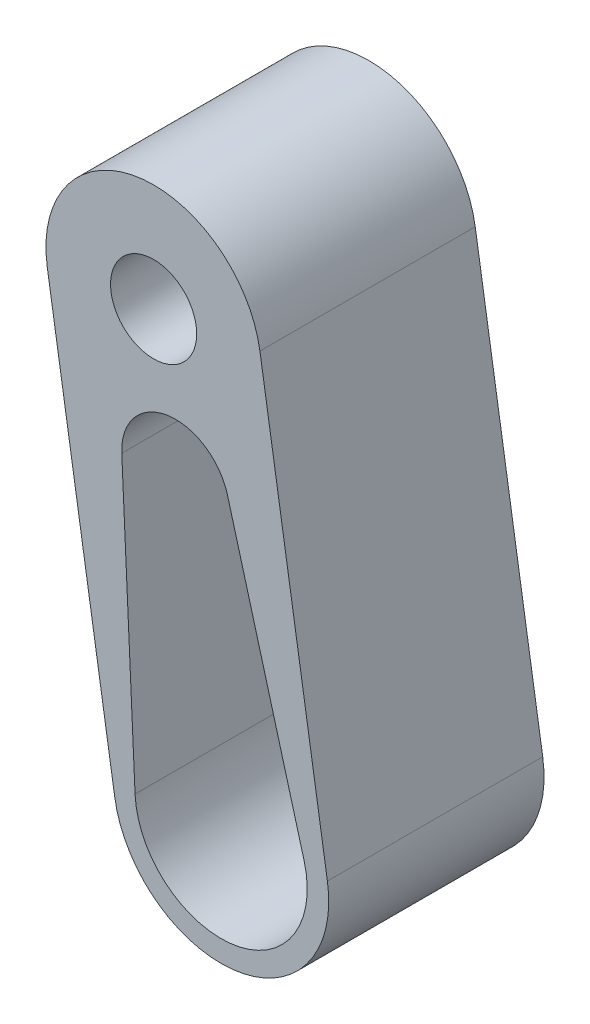
ISO-10303-21;
HEADER;
FILE_DESCRIPTION(('STEP AP214'),'2;1');
FILE_NAME('part.step','',(''),(''),'','','');
FILE_SCHEMA(('AUTOMOTIVE_DESIGN { 1 0 10303 214 1 1 1 1 }'));
ENDSEC;
DATA;
#1=APPLICATION_CONTEXT('core data for automotive mechanical design processes');
#2=APPLICATION_PROTOCOL_DEFINITION('international standard','automotive_design',2000,#1);
#3=PRODUCT_CONTEXT('',#1,'mechanical');
#4=PRODUCT('Part','Part','',(#3));
#5=PRODUCT_RELATED_PRODUCT_CATEGORY('part','',(#4));
#6=PRODUCT_DEFINITION_FORMATION('','',#4);
#7=PRODUCT_DEFINITION_CONTEXT('part definition',#1,'design');
#8=PRODUCT_DEFINITION('design','',#6,#7);
#9=PRODUCT_DEFINITION_SHAPE('','',#8);
#10=(LENGTH_UNIT() NAMED_UNIT(*) SI_UNIT(.MILLI.,.METRE.));
#11=(NAMED_UNIT(*) PLANE_ANGLE_UNIT() SI_UNIT($,.RADIAN.));
#12=(NAMED_UNIT(*) SI_UNIT($,.STERADIAN.) SOLID_ANGLE_UNIT());
#13=UNCERTAINTY_MEASURE_WITH_UNIT(LENGTH_MEASURE(1.E-05),#10,'distance_accuracy_value','');
#14=(GEOMETRIC_REPRESENTATION_CONTEXT(3) GLOBAL_UNCERTAINTY_ASSIGNED_CONTEXT((#13)) GLOBAL_UNIT_ASSIGNED_CONTEXT((#10,
#11,#12)) REPRESENTATION_CONTEXT('',''));
#15=CARTESIAN_POINT('',(0.,0.,0.));
#16=DIRECTION('',(0.,0.,1.));
#17=DIRECTION('',(1.,0.,0.));
#18=AXIS2_PLACEMENT_3D('',#15,#16,#17);
#19=CARTESIAN_POINT('',(-59.1343390927748,15.7528711445072,10.));
#20=DIRECTION('',(0.,0.,1.));
#21=DIRECTION('',(1.,0.,0.));
#22=AXIS2_PLACEMENT_3D('',#19,#20,#21);
#23=PLANE('',#22);
#24=CARTESIAN_POINT('',(-59.1343390927748,15.7528711445072,10.));
#25=DIRECTION('',(0.,0.,1.));
#26=DIRECTION('',(1.,0.,0.));
#27=AXIS2_PLACEMENT_3D('',#24,#25,#26);
#28=CIRCLE('',#27,5.);
#29=CARTESIAN_POINT('',(-54.196121306648,16.5364559177009,10.));
#30=VERTEX_POINT('',#29);
#31=CARTESIAN_POINT('',(-64.0725568789016,14.9692863713135,10.));
#32=VERTEX_POINT('',#31);
#33=EDGE_CURVE('E166',#30,#32,#28,.T.);
#34=ORIENTED_EDGE('',*,*,#33,.T.);
#35=DIRECTION('',(0.156716954638739,-0.987643557225358,0.));
#36=VECTOR('',#35,1.);
#37=CARTESIAN_POINT('',(-64.0725568789016,14.9692863713135,10.));
#38=LINE('',#37,#36);
#39=CARTESIAN_POINT('',(-60.9382177861268,-4.78358477319369,10.));
#40=VERTEX_POINT('',#39);
#41=EDGE_CURVE('E92',#32,#40,#38,.T.);
#42=ORIENTED_EDGE('',*,*,#41,.T.);
#43=CARTESIAN_POINT('',(-56.,-4.,10.));
#44=DIRECTION('',(0.,0.,1.));
#45=DIRECTION('',(1.,0.,0.));
#46=AXIS2_PLACEMENT_3D('',#43,#44,#45);
#47=CIRCLE('',#46,5.);
#48=CARTESIAN_POINT('',(-51.0617822138732,-3.21641522680631,10.));
#49=VERTEX_POINT('',#48);
#50=EDGE_CURVE('E169',#40,#49,#47,.T.);
#51=ORIENTED_EDGE('',*,*,#50,.T.);
#52=DIRECTION('',(-0.156716954638739,0.987643557225358,0.));
#53=VECTOR('',#52,1.);
#54=CARTESIAN_POINT('',(-54.196121306648,16.5364559177009,10.));
#55=LINE('',#54,#53);
#56=EDGE_CURVE('E64',#49,#30,#55,.T.);
#57=ORIENTED_EDGE('',*,*,#56,.T.);
#58=EDGE_LOOP('',(#34,#42,#51,#57));
#59=FACE_BOUND('',#58,.T.);
#60=CARTESIAN_POINT('',(-59.1343390927748,15.7528711445072,10.));
#61=DIRECTION('',(0.,0.,1.));
#62=DIRECTION('',(1.,0.,0.));
#63=AXIS2_PLACEMENT_3D('',#60,#61,#62);
#64=CIRCLE('',#63,2.);
#65=CARTESIAN_POINT('',(-57.1343390927748,15.7528711445072,10.));
#66=VERTEX_POINT('',#65);
#67=EDGE_CURVE('E160',#66,#66,#64,.T.);
#68=ORIENTED_EDGE('',*,*,#67,.F.);
#69=EDGE_LOOP('',(#68));
#70=FACE_BOUND('',#69,.T.);
#71=CARTESIAN_POINT('',(-58.115678887623,9.33318802254233,10.));
#72=DIRECTION('',(0.,0.,1.));
#73=DIRECTION('',(1.,0.,0.));
#74=AXIS2_PLACEMENT_3D('',#71,#72,#73);
#75=CIRCLE('',#74,2.5);
#76=CARTESIAN_POINT('',(-55.7053912289164,9.99689985932601,10.));
#77=VERTEX_POINT('',#76);
#78=CARTESIAN_POINT('',(-60.6130315211288,9.21816705088385,10.));
#79=VERTEX_POINT('',#78);
#80=EDGE_CURVE('E144',#77,#79,#75,.T.);
#81=ORIENTED_EDGE('',*,*,#80,.F.);
#82=DIRECTION('',(0.265484734713471,-0.964115063482631,0.));
#83=VECTOR('',#82,1.);
#84=CARTESIAN_POINT('',(-49.2203709890279,-13.5536282228787,10.));
#85=LINE('',#84,#83);
#86=CARTESIAN_POINT('',(-52.1435397460695,-2.93806106114612,10.));
#87=VERTEX_POINT('',#86);
#88=EDGE_CURVE('E55',#77,#87,#85,.T.);
#89=ORIENTED_EDGE('',*,*,#88,.T.);
#90=CARTESIAN_POINT('',(-56.,-4.,10.));
#91=DIRECTION('',(0.,0.,1.));
#92=DIRECTION('',(1.,0.,0.));
#93=AXIS2_PLACEMENT_3D('',#90,#91,#92);
#94=CIRCLE('',#93,4.);
#95=CARTESIAN_POINT('',(-59.9957642136094,-4.18403355465357,10.));
#96=VERTEX_POINT('',#95);
#97=EDGE_CURVE('E132',#96,#87,#94,.T.);
#98=ORIENTED_EDGE('',*,*,#97,.F.);
#99=DIRECTION('',(0.0460083886633916,-0.998941053402351,0.));
#100=VECTOR('',#99,1.);
#101=CARTESIAN_POINT('',(-60.0610636642219,-2.76624206322135,10.));
#102=LINE('',#101,#100);
#103=EDGE_CURVE('E146',#79,#96,#102,.T.);
#104=ORIENTED_EDGE('',*,*,#103,.F.);
#105=EDGE_LOOP('',(#81,#89,#98,#104));
#106=FACE_BOUND('',#105,.T.);
#107=ADVANCED_FACE('F40',(#59,#70,#106),#23,.T.);
#108=CARTESIAN_POINT('',(-56.,-4.,10.));
#109=DIRECTION('',(0.,0.,-1.));
#110=DIRECTION('',(-1.,0.,0.));
#111=AXIS2_PLACEMENT_3D('',#108,#109,#110);
#112=CYLINDRICAL_SURFACE('',#111,2.);
#113=CARTESIAN_POINT('',(-56.,-4.,0.));
#114=DIRECTION('',(0.,0.,1.));
#115=DIRECTION('',(1.,0.,0.));
#116=AXIS2_PLACEMENT_3D('',#113,#114,#115);
#117=CIRCLE('',#116,2.);
#118=CARTESIAN_POINT('',(-54.,-4.,0.));
#119=VERTEX_POINT('',#118);
#120=EDGE_CURVE('E153',#119,#119,#117,.T.);
#121=ORIENTED_EDGE('',*,*,#120,.F.);
#122=EDGE_LOOP('',(#121));
#123=FACE_BOUND('',#122,.T.);
#124=CARTESIAN_POINT('',(-56.,-4.,2.));
#125=DIRECTION('',(0.,0.,1.));
#126=DIRECTION('',(1.,0.,0.));
#127=AXIS2_PLACEMENT_3D('',#124,#125,#126);
#128=CIRCLE('',#127,2.);
#129=CARTESIAN_POINT('',(-54.,-4.,2.));
#130=VERTEX_POINT('',#129);
#131=EDGE_CURVE('E121',#130,#130,#128,.F.);
#132=ORIENTED_EDGE('',*,*,#131,.F.);
#133=EDGE_LOOP('',(#132));
#134=FACE_BOUND('',#133,.T.);
#135=ADVANCED_FACE('F209',(#123,#134),#112,.F.);
#136=CARTESIAN_POINT('',(-59.1343390927748,15.7528711445072,0.));
#137=DIRECTION('',(0.,0.,1.));
#138=DIRECTION('',(1.,0.,0.));
#139=AXIS2_PLACEMENT_3D('',#136,#137,#138);
#140=PLANE('',#139);
#141=CARTESIAN_POINT('',(-59.1343390927748,15.7528711445072,0.));
#142=DIRECTION('',(0.,0.,1.));
#143=DIRECTION('',(1.,0.,0.));
#144=AXIS2_PLACEMENT_3D('',#141,#142,#143);
#145=CIRCLE('',#144,5.);
#146=CARTESIAN_POINT('',(-54.196121306648,16.5364559177009,0.));
#147=VERTEX_POINT('',#146);
#148=CARTESIAN_POINT('',(-64.0725568789016,14.9692863713135,0.));
#149=VERTEX_POINT('',#148);
#150=EDGE_CURVE('E163',#147,#149,#145,.T.);
#151=ORIENTED_EDGE('',*,*,#150,.F.);
#152=DIRECTION('',(-0.156716954638739,0.987643557225358,0.));
#153=VECTOR('',#152,1.);
#154=CARTESIAN_POINT('',(-54.196121306648,16.5364559177009,0.));
#155=LINE('',#154,#153);
#156=CARTESIAN_POINT('',(-51.0617822138732,-3.21641522680631,0.));
#157=VERTEX_POINT('',#156);
#158=EDGE_CURVE('E85',#157,#147,#155,.T.);
#159=ORIENTED_EDGE('',*,*,#158,.F.);
#160=CARTESIAN_POINT('',(-56.,-4.,0.));
#161=DIRECTION('',(0.,0.,1.));
#162=DIRECTION('',(1.,0.,0.));
#163=AXIS2_PLACEMENT_3D('',#160,#161,#162);
#164=CIRCLE('',#163,5.);
#165=CARTESIAN_POINT('',(-60.9382177861268,-4.78358477319369,0.));
#166=VERTEX_POINT('',#165);
#167=EDGE_CURVE('E177',#166,#157,#164,.T.);
#168=ORIENTED_EDGE('',*,*,#167,.F.);
#169=DIRECTION('',(0.156716954638739,-0.987643557225358,0.));
#170=VECTOR('',#169,1.);
#171=CARTESIAN_POINT('',(-64.0725568789016,14.9692863713135,0.));
#172=LINE('',#171,#170);
#173=EDGE_CURVE('E175',#149,#166,#172,.T.);
#174=ORIENTED_EDGE('',*,*,#173,.F.);
#175=EDGE_LOOP('',(#151,#159,#168,#174));
#176=FACE_BOUND('',#175,.T.);
#177=CARTESIAN_POINT('',(-59.1343390927748,15.7528711445072,0.));
#178=DIRECTION('',(0.,0.,1.));
#179=DIRECTION('',(1.,0.,0.));
#180=AXIS2_PLACEMENT_3D('',#177,#178,#179);
#181=CIRCLE('',#180,2.);
#182=CARTESIAN_POINT('',(-57.1343390927748,15.7528711445072,0.));
#183=VERTEX_POINT('',#182);
#184=EDGE_CURVE('E159',#183,#183,#181,.T.);
#185=ORIENTED_EDGE('',*,*,#184,.T.);
#186=EDGE_LOOP('',(#185));
#187=FACE_BOUND('',#186,.T.);
#188=ORIENTED_EDGE('',*,*,#120,.T.);
#189=EDGE_LOOP('',(#188));
#190=FACE_BOUND('',#189,.T.);
#191=ADVANCED_FACE('F190',(#176,#187,#190),#140,.F.);
#192=CARTESIAN_POINT('',(-59.1343390927748,15.7528711445072,10.));
#193=DIRECTION('',(0.,0.,-1.));
#194=DIRECTION('',(-1.,0.,0.));
#195=AXIS2_PLACEMENT_3D('',#192,#193,#194);
#196=CYLINDRICAL_SURFACE('',#195,5.);
#197=ORIENTED_EDGE('',*,*,#150,.T.);
#198=DIRECTION('',(0.,0.,-1.));
#199=VECTOR('',#198,1.);
#200=CARTESIAN_POINT('',(-64.0725568789016,14.9692863713135,10.));
#201=LINE('',#200,#199);
#202=EDGE_CURVE('E11',#32,#149,#201,.T.);
#203=ORIENTED_EDGE('',*,*,#202,.F.);
#204=ORIENTED_EDGE('',*,*,#33,.F.);
#205=DIRECTION('',(0.,0.,-1.));
#206=VECTOR('',#205,1.);
#207=CARTESIAN_POINT('',(-54.196121306648,16.5364559177009,10.));
#208=LINE('',#207,#206);
#209=EDGE_CURVE('E172',#30,#147,#208,.T.);
#210=ORIENTED_EDGE('',*,*,#209,.T.);
#211=EDGE_LOOP('',(#197,#203,#204,#210));
#212=FACE_BOUND('',#211,.T.);
#213=ADVANCED_FACE('F42',(#212),#196,.T.);
#214=CARTESIAN_POINT('',(-64.0725568789016,14.9692863713135,10.));
#215=DIRECTION('',(0.987643557225358,0.156716954638739,0.));
#216=DIRECTION('',(-0.156716954638739,0.987643557225358,0.));
#217=AXIS2_PLACEMENT_3D('',#214,#215,#216);
#218=PLANE('',#217);
#219=ORIENTED_EDGE('',*,*,#173,.T.);
#220=DIRECTION('',(0.,0.,-1.));
#221=VECTOR('',#220,1.);
#222=CARTESIAN_POINT('',(-60.9382177861268,-4.78358477319369,10.));
#223=LINE('',#222,#221);
#224=EDGE_CURVE('E48',#40,#166,#223,.T.);
#225=ORIENTED_EDGE('',*,*,#224,.F.);
#226=ORIENTED_EDGE('',*,*,#41,.F.);
#227=ORIENTED_EDGE('',*,*,#202,.T.);
#228=EDGE_LOOP('',(#219,#225,#226,#227));
#229=FACE_BOUND('',#228,.T.);
#230=ADVANCED_FACE('F205',(#229),#218,.F.);
#231=CARTESIAN_POINT('',(-56.,-4.,10.));
#232=DIRECTION('',(0.,0.,-1.));
#233=DIRECTION('',(-1.,0.,0.));
#234=AXIS2_PLACEMENT_3D('',#231,#232,#233);
#235=CYLINDRICAL_SURFACE('',#234,5.);
#236=ORIENTED_EDGE('',*,*,#167,.T.);
#237=DIRECTION('',(0.,0.,-1.));
#238=VECTOR('',#237,1.);
#239=CARTESIAN_POINT('',(-51.0617822138732,-3.21641522680631,10.));
#240=LINE('',#239,#238);
#241=EDGE_CURVE('E181',#49,#157,#240,.T.);
#242=ORIENTED_EDGE('',*,*,#241,.F.);
#243=ORIENTED_EDGE('',*,*,#50,.F.);
#244=ORIENTED_EDGE('',*,*,#224,.T.);
#245=EDGE_LOOP('',(#236,#242,#243,#244));
#246=FACE_BOUND('',#245,.T.);
#247=ADVANCED_FACE('F186',(#246),#235,.T.);
#248=CARTESIAN_POINT('',(-54.196121306648,16.5364559177009,10.));
#249=DIRECTION('',(-0.987643557225358,-0.156716954638739,0.));
#250=DIRECTION('',(0.156716954638739,-0.987643557225358,0.));
#251=AXIS2_PLACEMENT_3D('',#248,#249,#250);
#252=PLANE('',#251);
#253=ORIENTED_EDGE('',*,*,#158,.T.);
#254=ORIENTED_EDGE('',*,*,#209,.F.);
#255=ORIENTED_EDGE('',*,*,#56,.F.);
#256=ORIENTED_EDGE('',*,*,#241,.T.);
#257=EDGE_LOOP('',(#253,#254,#255,#256));
#258=FACE_BOUND('',#257,.T.);
#259=ADVANCED_FACE('F195',(#258),#252,.F.);
#260=CARTESIAN_POINT('',(-59.1343390927748,15.7528711445072,10.));
#261=DIRECTION('',(0.,0.,-1.));
#262=DIRECTION('',(-1.,0.,0.));
#263=AXIS2_PLACEMENT_3D('',#260,#261,#262);
#264=CYLINDRICAL_SURFACE('',#263,2.);
#265=ORIENTED_EDGE('',*,*,#67,.T.);
#266=EDGE_LOOP('',(#265));
#267=FACE_BOUND('',#266,.T.);
#268=ORIENTED_EDGE('',*,*,#184,.F.);
#269=EDGE_LOOP('',(#268));
#270=FACE_BOUND('',#269,.T.);
#271=ADVANCED_FACE('F197',(#267,#270),#264,.F.);
#272=CARTESIAN_POINT('',(-49.2203709890279,-13.5536282228787,2.));
#273=DIRECTION('',(-0.964115063482631,-0.265484734713471,0.));
#274=DIRECTION('',(0.265484734713471,-0.964115063482631,0.));
#275=AXIS2_PLACEMENT_3D('',#272,#273,#274);
#276=PLANE('',#275);
#277=ORIENTED_EDGE('',*,*,#88,.F.);
#278=DIRECTION('',(0.,0.,1.));
#279=VECTOR('',#278,1.);
#280=CARTESIAN_POINT('',(-55.7053912289164,9.99689985932601,2.));
#281=LINE('',#280,#279);
#282=CARTESIAN_POINT('',(-55.7053912289164,9.99689985932601,2.));
#283=VERTEX_POINT('',#282);
#284=EDGE_CURVE('E111',#283,#77,#281,.T.);
#285=ORIENTED_EDGE('',*,*,#284,.F.);
#286=DIRECTION('',(0.265484734713471,-0.964115063482631,0.));
#287=VECTOR('',#286,1.);
#288=CARTESIAN_POINT('',(-49.2203709890279,-13.5536282228787,2.));
#289=LINE('',#288,#287);
#290=CARTESIAN_POINT('',(-52.1435397460695,-2.93806106114612,2.));
#291=VERTEX_POINT('',#290);
#292=EDGE_CURVE('E114',#283,#291,#289,.T.);
#293=ORIENTED_EDGE('',*,*,#292,.T.);
#294=DIRECTION('',(0.,0.,1.));
#295=VECTOR('',#294,1.);
#296=CARTESIAN_POINT('',(-52.1435397460695,-2.93806106114612,2.));
#297=LINE('',#296,#295);
#298=EDGE_CURVE('E151',#291,#87,#297,.T.);
#299=ORIENTED_EDGE('',*,*,#298,.T.);
#300=EDGE_LOOP('',(#277,#285,#293,#299));
#301=FACE_BOUND('',#300,.T.);
#302=ADVANCED_FACE('F113',(#301),#276,.T.);
#303=CARTESIAN_POINT('',(-56.,-4.,2.));
#304=DIRECTION('',(0.,0.,1.));
#305=DIRECTION('',(1.,0.,0.));
#306=AXIS2_PLACEMENT_3D('',#303,#304,#305);
#307=CYLINDRICAL_SURFACE('',#306,4.);
#308=ORIENTED_EDGE('',*,*,#97,.T.);
#309=ORIENTED_EDGE('',*,*,#298,.F.);
#310=CARTESIAN_POINT('',(-56.,-4.,2.));
#311=DIRECTION('',(0.,0.,1.));
#312=DIRECTION('',(1.,0.,0.));
#313=AXIS2_PLACEMENT_3D('',#310,#311,#312);
#314=CIRCLE('',#313,4.);
#315=CARTESIAN_POINT('',(-59.9957642136094,-4.18403355465357,2.));
#316=VERTEX_POINT('',#315);
#317=EDGE_CURVE('E131',#316,#291,#314,.T.);
#318=ORIENTED_EDGE('',*,*,#317,.F.);
#319=DIRECTION('',(0.,0.,1.));
#320=VECTOR('',#319,1.);
#321=CARTESIAN_POINT('',(-59.9957642136094,-4.18403355465357,2.));
#322=LINE('',#321,#320);
#323=EDGE_CURVE('E154',#316,#96,#322,.T.);
#324=ORIENTED_EDGE('',*,*,#323,.T.);
#325=EDGE_LOOP('',(#308,#309,#318,#324));
#326=FACE_BOUND('',#325,.T.);
#327=ADVANCED_FACE('F260',(#326),#307,.F.);
#328=CARTESIAN_POINT('',(-60.0610636642219,-2.76624206322135,2.));
#329=DIRECTION('',(-0.998941053402351,-0.0460083886633915,0.));
#330=DIRECTION('',(0.0460083886633915,-0.998941053402351,0.));
#331=AXIS2_PLACEMENT_3D('',#328,#329,#330);
#332=PLANE('',#331);
#333=ORIENTED_EDGE('',*,*,#103,.T.);
#334=ORIENTED_EDGE('',*,*,#323,.F.);
#335=DIRECTION('',(0.0460083886633916,-0.998941053402351,0.));
#336=VECTOR('',#335,1.);
#337=CARTESIAN_POINT('',(-60.0610636642219,-2.76624206322135,2.));
#338=LINE('',#337,#336);
#339=CARTESIAN_POINT('',(-60.6130315211288,9.21816705088385,2.));
#340=VERTEX_POINT('',#339);
#341=EDGE_CURVE('E136',#340,#316,#338,.T.);
#342=ORIENTED_EDGE('',*,*,#341,.F.);
#343=DIRECTION('',(0.,0.,1.));
#344=VECTOR('',#343,1.);
#345=CARTESIAN_POINT('',(-60.6130315211288,9.21816705088385,2.));
#346=LINE('',#345,#344);
#347=EDGE_CURVE('E120',#340,#79,#346,.T.);
#348=ORIENTED_EDGE('',*,*,#347,.T.);
#349=EDGE_LOOP('',(#333,#334,#342,#348));
#350=FACE_BOUND('',#349,.T.);
#351=ADVANCED_FACE('F269',(#350),#332,.F.);
#352=CARTESIAN_POINT('',(-58.115678887623,9.33318802254233,2.));
#353=DIRECTION('',(0.,0.,1.));
#354=DIRECTION('',(1.,0.,0.));
#355=AXIS2_PLACEMENT_3D('',#352,#353,#354);
#356=CYLINDRICAL_SURFACE('',#355,2.5);
#357=ORIENTED_EDGE('',*,*,#80,.T.);
#358=ORIENTED_EDGE('',*,*,#347,.F.);
#359=CARTESIAN_POINT('',(-58.115678887623,9.33318802254233,2.));
#360=DIRECTION('',(0.,0.,1.));
#361=DIRECTION('',(1.,0.,0.));
#362=AXIS2_PLACEMENT_3D('',#359,#360,#361);
#363=CIRCLE('',#362,2.5);
#364=EDGE_CURVE('E129',#283,#340,#363,.T.);
#365=ORIENTED_EDGE('',*,*,#364,.F.);
#366=ORIENTED_EDGE('',*,*,#284,.T.);
#367=EDGE_LOOP('',(#357,#358,#365,#366));
#368=FACE_BOUND('',#367,.T.);
#369=ADVANCED_FACE('F134',(#368),#356,.F.);
#370=CARTESIAN_POINT('',(0.,0.,2.));
#371=DIRECTION('',(0.,0.,1.));
#372=DIRECTION('',(1.,0.,0.));
#373=AXIS2_PLACEMENT_3D('',#370,#371,#372);
#374=PLANE('',#373);
#375=ORIENTED_EDGE('',*,*,#292,.F.);
#376=ORIENTED_EDGE('',*,*,#364,.T.);
#377=ORIENTED_EDGE('',*,*,#341,.T.);
#378=ORIENTED_EDGE('',*,*,#317,.T.);
#379=EDGE_LOOP('',(#375,#376,#377,#378));
#380=FACE_BOUND('',#379,.T.);
#381=ORIENTED_EDGE('',*,*,#131,.T.);
#382=EDGE_LOOP('',(#381));
#383=FACE_BOUND('',#382,.T.);
#384=ADVANCED_FACE('F126',(#380,#383),#374,.T.);
#385=CLOSED_SHELL('',(#107,#135,#191,#213,#230,#247,#259,#271,#302,#327,#351,#369,#384));
#386=MANIFOLD_SOLID_BREP('B2',#385);
#387=ADVANCED_BREP_SHAPE_REPRESENTATION('',(#18,#386),#14);
#388=SHAPE_DEFINITION_REPRESENTATION(#9,#387);
ENDSEC;
END-ISO-10303-21;
